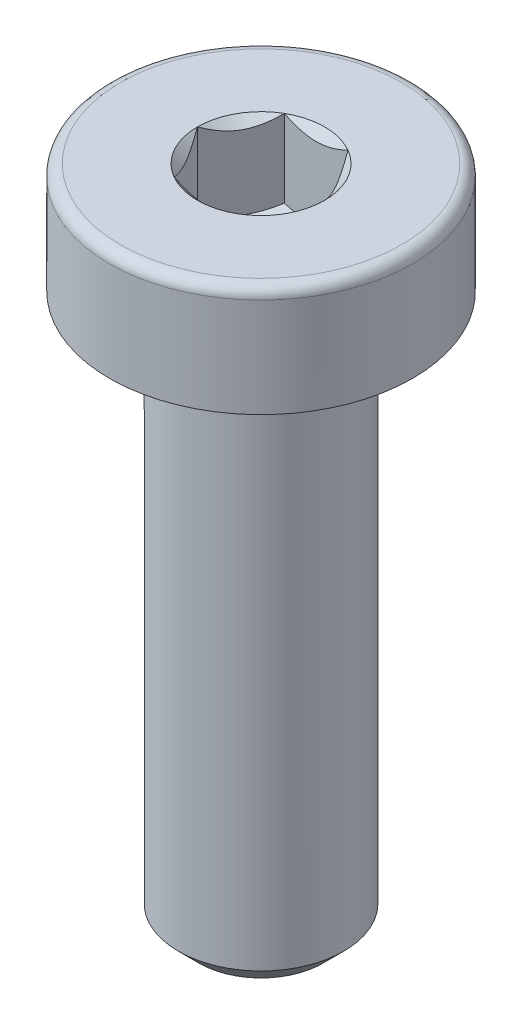
ISO-10303-21;
HEADER;
FILE_DESCRIPTION(('STEP AP214'),'2;1');
FILE_NAME('part.step','',(''),(''),'','','');
FILE_SCHEMA(('AUTOMOTIVE_DESIGN { 1 0 10303 214 1 1 1 1 }'));
ENDSEC;
DATA;
#1=APPLICATION_CONTEXT('core data for automotive mechanical design processes');
#2=APPLICATION_PROTOCOL_DEFINITION('international standard','automotive_design',2000,#1);
#3=PRODUCT_CONTEXT('',#1,'mechanical');
#4=PRODUCT('Part','Part','',(#3));
#5=PRODUCT_RELATED_PRODUCT_CATEGORY('part','',(#4));
#6=PRODUCT_DEFINITION_FORMATION('','',#4);
#7=PRODUCT_DEFINITION_CONTEXT('part definition',#1,'design');
#8=PRODUCT_DEFINITION('design','',#6,#7);
#9=PRODUCT_DEFINITION_SHAPE('','',#8);
#10=(LENGTH_UNIT() NAMED_UNIT(*) SI_UNIT(.MILLI.,.METRE.));
#11=(NAMED_UNIT(*) PLANE_ANGLE_UNIT() SI_UNIT($,.RADIAN.));
#12=(NAMED_UNIT(*) SI_UNIT($,.STERADIAN.) SOLID_ANGLE_UNIT());
#13=UNCERTAINTY_MEASURE_WITH_UNIT(LENGTH_MEASURE(1.E-05),#10,'distance_accuracy_value','');
#14=(GEOMETRIC_REPRESENTATION_CONTEXT(3) GLOBAL_UNCERTAINTY_ASSIGNED_CONTEXT((#13)) GLOBAL_UNIT_ASSIGNED_CONTEXT((#10,
#11,#12)) REPRESENTATION_CONTEXT('',''));
#15=CARTESIAN_POINT('',(0.,0.,0.));
#16=DIRECTION('',(0.,0.,1.));
#17=DIRECTION('',(1.,0.,0.));
#18=AXIS2_PLACEMENT_3D('',#15,#16,#17);
#19=CARTESIAN_POINT('',(0.,-0.2,0.));
#20=DIRECTION('',(0.,1.,0.));
#21=DIRECTION('',(0.,0.,1.));
#22=AXIS2_PLACEMENT_3D('',#19,#20,#21);
#23=TOROIDAL_SURFACE('',#22,1.7,0.2);
#24=CARTESIAN_POINT('',(0.,0.,0.));
#25=DIRECTION('',(0.,1.,0.));
#26=DIRECTION('',(0.,0.,1.));
#27=AXIS2_PLACEMENT_3D('',#24,#25,#26);
#28=CIRCLE('',#27,1.7);
#29=CARTESIAN_POINT('',(0.,0.,1.7));
#30=VERTEX_POINT('',#29);
#31=EDGE_CURVE('E143',#30,#30,#28,.T.);
#32=ORIENTED_EDGE('',*,*,#31,.F.);
#33=EDGE_LOOP('',(#32));
#34=FACE_BOUND('',#33,.T.);
#35=CARTESIAN_POINT('',(0.,-0.2,0.));
#36=DIRECTION('',(0.,-1.,0.));
#37=DIRECTION('',(0.,0.,1.));
#38=AXIS2_PLACEMENT_3D('',#35,#36,#37);
#39=CIRCLE('',#38,1.5);
#40=CARTESIAN_POINT('',(0.,-0.2,1.5));
#41=VERTEX_POINT('',#40);
#42=EDGE_CURVE('E422',#41,#41,#39,.T.);
#43=ORIENTED_EDGE('',*,*,#42,.F.);
#44=EDGE_LOOP('',(#43));
#45=FACE_BOUND('',#44,.T.);
#46=ADVANCED_FACE('F15',(#34,#45),#23,.F.);
#47=CARTESIAN_POINT('',(0.,-10.,0.));
#48=DIRECTION('',(0.,1.,0.));
#49=DIRECTION('',(1.,0.,0.));
#50=AXIS2_PLACEMENT_3D('',#47,#48,#49);
#51=PLANE('',#50);
#52=CARTESIAN_POINT('',(0.,-10.,0.));
#53=DIRECTION('',(0.,-1.,0.));
#54=DIRECTION('',(0.,0.,1.));
#55=AXIS2_PLACEMENT_3D('',#52,#53,#54);
#56=CIRCLE('',#55,1.125);
#57=CARTESIAN_POINT('',(0.,-10.,1.125));
#58=VERTEX_POINT('',#57);
#59=EDGE_CURVE('E10',#58,#58,#56,.T.);
#60=ORIENTED_EDGE('',*,*,#59,.T.);
#61=EDGE_LOOP('',(#60));
#62=FACE_BOUND('',#61,.T.);
#63=ADVANCED_FACE('F510',(#62),#51,.F.);
#64=CARTESIAN_POINT('',(0.,-10.125,0.));
#65=DIRECTION('',(0.,1.,0.));
#66=DIRECTION('',(-1.,0.,0.));
#67=AXIS2_PLACEMENT_3D('',#64,#65,#66);
#68=CONICAL_SURFACE('',#67,1.,0.785398163397448);
#69=ORIENTED_EDGE('',*,*,#59,.F.);
#70=EDGE_LOOP('',(#69));
#71=FACE_BOUND('',#70,.T.);
#72=CARTESIAN_POINT('',(0.,-9.625,0.));
#73=DIRECTION('',(0.,-1.,0.));
#74=DIRECTION('',(-1.,0.,0.));
#75=AXIS2_PLACEMENT_3D('',#72,#73,#74);
#76=CIRCLE('',#75,1.5);
#77=CARTESIAN_POINT('',(-1.5,-9.625,0.));
#78=VERTEX_POINT('',#77);
#79=EDGE_CURVE('E418',#78,#78,#76,.T.);
#80=ORIENTED_EDGE('',*,*,#79,.T.);
#81=EDGE_LOOP('',(#80));
#82=FACE_BOUND('',#81,.T.);
#83=ADVANCED_FACE('F308',(#71,#82),#68,.T.);
#84=CARTESIAN_POINT('',(-1.15470053837925,0.5,0.));
#85=DIRECTION('',(-0.866025403784439,0.,0.5));
#86=DIRECTION('',(0.,1.,0.));
#87=AXIS2_PLACEMENT_3D('',#84,#85,#86);
#88=PLANE('',#87);
#89=CARTESIAN_POINT('',(-1.15470053837925,2.,0.));
#90=CARTESIAN_POINT('',(-1.00117078125086,1.84647024287162,0.265921339820074));
#91=CARTESIAN_POINT('',(-0.867089249093141,1.84530172515184,0.498157365873931));
#92=CARTESIAN_POINT('',(-0.733215253083504,1.8441350161052,0.730033928774895));
#93=CARTESIAN_POINT('',(-0.57735026918948,1.99999999999927,1.00000000000025));
#94=B_SPLINE_CURVE_WITH_KNOTS('',2,(#89,#90,#91,#92,#93),.UNSPECIFIED.,.F.,.F.,(3,2,3),(0.,0.5,
1.),.UNSPECIFIED.);
#95=CARTESIAN_POINT('',(-1.15470053837925,2.,0.));
#96=VERTEX_POINT('',#95);
#97=CARTESIAN_POINT('',(-0.577350269189626,2.,1.));
#98=VERTEX_POINT('',#97);
#99=EDGE_CURVE('E135',#96,#98,#94,.T.);
#100=ORIENTED_EDGE('',*,*,#99,.T.);
#101=DIRECTION('',(0.,1.,0.));
#102=VECTOR('',#101,1.);
#103=CARTESIAN_POINT('',(-0.577350269189626,0.5,1.));
#104=LINE('',#103,#102);
#105=CARTESIAN_POINT('',(-0.577350269189626,0.589316397477042,1.));
#106=VERTEX_POINT('',#105);
#107=EDGE_CURVE('E118',#106,#98,#104,.T.);
#108=ORIENTED_EDGE('',*,*,#107,.F.);
#109=CARTESIAN_POINT('',(-1.15470053837925,0.589316397477043,0.));
#110=CARTESIAN_POINT('',(-1.1422776254852,0.582145061548454,0.021515887063845));
#111=CARTESIAN_POINT('',(-1.12980572440145,0.575290529962869,0.0431130815008311));
#112=CARTESIAN_POINT('',(-1.10516877386456,0.562518070323557,0.0858404042081745));
#113=CARTESIAN_POINT('',(-1.09300571707735,0.556578244850613,0.106965156736799));
#114=CARTESIAN_POINT('',(-1.06894241920652,0.545632531934319,0.148883907199831));
#115=CARTESIAN_POINT('',(-1.05704304561731,0.540607317583832,0.169673316642415));
#116=CARTESIAN_POINT('',(-1.03344126715609,0.531488117613305,0.211063578718422));
#117=CARTESIAN_POINT('',(-1.02173909837023,0.527379242171332,0.231661269176965));
#118=CARTESIAN_POINT('',(-0.998439619296902,0.520087570224119,0.272815704232481));
#119=CARTESIAN_POINT('',(-0.986842367431211,0.516896357949622,0.293370983478975));
#120=CARTESIAN_POINT('',(-0.963630649649038,0.511432897740972,0.33458880079611));
#121=CARTESIAN_POINT('',(-0.952016187375457,0.509160477291832,0.355251317992815));
#122=CARTESIAN_POINT('',(-0.928615137972573,0.505525933544308,0.396828053797181));
#123=CARTESIAN_POINT('',(-0.916827980653532,0.504172969622274,0.41774275139525));
#124=CARTESIAN_POINT('',(-0.892891053471395,0.502367479696766,0.459958305071784));
#125=CARTESIAN_POINT('',(-0.88073874884194,0.501933526563364,0.481258507610898));
#126=CARTESIAN_POINT('',(-0.856257235695783,0.501957698326459,0.523654214585648));
#127=CARTESIAN_POINT('',(-0.843928822248721,0.502412614939665,0.544750180023796));
#128=CARTESIAN_POINT('',(-0.819420681665752,0.504253995001974,0.586439287846091));
#129=CARTESIAN_POINT('',(-0.80724270276635,0.505622235893781,0.607034252182705));
#130=CARTESIAN_POINT('',(-0.783017066755103,0.509280885955065,0.647952632793485));
#131=CARTESIAN_POINT('',(-0.770969274303699,0.511562376898162,0.668276765739735));
#132=CARTESIAN_POINT('',(-0.746956492541301,0.51703779791969,0.708859066345339));
#133=CARTESIAN_POINT('',(-0.734991529583474,0.520232005852064,0.729117212014218));
#134=CARTESIAN_POINT('',(-0.711075209617807,0.527523596594688,0.769746807127452));
#135=CARTESIAN_POINT('',(-0.699125090769733,0.531629372272877,0.790117471798635));
#136=CARTESIAN_POINT('',(-0.675154824355723,0.540736433878131,0.831125976310756));
#137=CARTESIAN_POINT('',(-0.663137276162293,0.545752483880906,0.851762040669467));
#138=CARTESIAN_POINT('',(-0.638941132936142,0.556674024791821,0.893430606128303));
#139=CARTESIAN_POINT('',(-0.626766044340648,0.562598648059455,0.914460089337463));
#140=CARTESIAN_POINT('',(-0.602159683115032,0.575334898103387,0.957023431622116));
#141=CARTESIAN_POINT('',(-0.58973203881774,0.582168191432241,0.978552925679333));
#142=CARTESIAN_POINT('',(-0.57735026918962,0.589316397477036,0.999999999999998));
#143=B_SPLINE_CURVE_WITH_KNOTS('',3,(#109,#110,#111,#112,#113,#114,#115,#116,#117,#118,#119,
#120,#121,#122,#123,#124,#125,#126,#127,#128,#129,#130,#131,#132,#133,#134,#135,#136,#137,#138,
#139,#140,#141,#142),.UNSPECIFIED.,.F.,.F.,(4,2,2,2,2,2,2,2,2,2,2,2,2,2,2,2,4),(0.,
0.0775799336285172,0.15283713344211,0.226249266739255,0.298363815314992,0.369794224205565,
0.441211214882481,0.51332960442225,0.586892093802747,0.66018955743096,0.732066645944519,
0.803258313913417,0.8744716775434,0.946370107950428,1.01956032219192,1.09458388807375,
1.17191346643988),.UNSPECIFIED.);
#144=CARTESIAN_POINT('',(-1.15470053837925,0.589316397477044,0.));
#145=VERTEX_POINT('',#144);
#146=EDGE_CURVE('E245',#145,#106,#143,.T.);
#147=ORIENTED_EDGE('',*,*,#146,.F.);
#148=DIRECTION('',(0.,1.,0.));
#149=VECTOR('',#148,1.);
#150=CARTESIAN_POINT('',(-1.15470053837925,0.5,0.));
#151=LINE('',#150,#149);
#152=EDGE_CURVE('E29',#145,#96,#151,.T.);
#153=ORIENTED_EDGE('',*,*,#152,.T.);
#154=EDGE_LOOP('',(#100,#108,#147,#153));
#155=FACE_BOUND('',#154,.T.);
#156=ADVANCED_FACE('F138',(#155),#88,.F.);
#157=CARTESIAN_POINT('',(-0.577350269189624,0.5,-1.));
#158=DIRECTION('',(-0.866025403784438,0.,-0.5));
#159=DIRECTION('',(-0.5,0.,0.866025403784438));
#160=AXIS2_PLACEMENT_3D('',#157,#158,#159);
#161=PLANE('',#160);
#162=CARTESIAN_POINT('',(-0.577350269189625,2.,-0.999999999999998));
#163=CARTESIAN_POINT('',(-0.730880026318,1.84647024287162,-0.734078660179944));
#164=CARTESIAN_POINT('',(-0.864961558475733,1.84530172515184,-0.501842634126069));
#165=CARTESIAN_POINT('',(-0.998835554485382,1.8441350161052,-0.269966071225084));
#166=CARTESIAN_POINT('',(-1.15470053837939,1.99999999999928,2.43945488809238E-13));
#167=B_SPLINE_CURVE_WITH_KNOTS('',2,(#162,#163,#164,#165,#166),.UNSPECIFIED.,.F.,.F.,(3,2,3),
(0.,0.5,1.),.UNSPECIFIED.);
#168=CARTESIAN_POINT('',(-0.577350269189625,2.,-1.));
#169=VERTEX_POINT('',#168);
#170=EDGE_CURVE('E339',#169,#96,#167,.T.);
#171=ORIENTED_EDGE('',*,*,#170,.T.);
#172=ORIENTED_EDGE('',*,*,#152,.F.);
#173=CARTESIAN_POINT('',(-0.577350269189627,0.589316397477045,-1.));
#174=CARTESIAN_POINT('',(-0.589772117524805,0.582145061548479,-0.978483498312897));
#175=CARTESIAN_POINT('',(-0.602239886015797,0.575290529962917,-0.956883917922458));
#176=CARTESIAN_POINT('',(-0.626924357647565,0.562518070323645,-0.914184031532187));
#177=CARTESIAN_POINT('',(-0.639137401592391,0.556578244850719,-0.893088139102523));
#178=CARTESIAN_POINT('',(-0.663408455452852,0.54563253193445,-0.851289336616123));
#179=CARTESIAN_POINT('',(-0.675462925365203,0.540607317583974,-0.830589472077488));
#180=CARTESIAN_POINT('',(-0.699507054561722,0.53148811761346,-0.789454601317619));
#181=CARTESIAN_POINT('',(-0.711494093365185,0.527379242171491,-0.769021380640425));
#182=CARTESIAN_POINT('',(-0.735485140065021,0.520087570224278,-0.728266222340228));
#183=CARTESIAN_POINT('',(-0.747487908141538,0.516896357949778,-0.707945067987197));
#184=CARTESIAN_POINT('',(-0.771577726135665,0.511432897741115,-0.667234222063753));
#185=CARTESIAN_POINT('',(-0.783664759797369,0.509160477291966,-0.646844544085154));
#186=CARTESIAN_POINT('',(-0.807970744508966,0.505525933544416,-0.605790272924778));
#187=CARTESIAN_POINT('',(-0.820189825281854,0.504172969622366,-0.585124946448999));
#188=CARTESIAN_POINT('',(-0.844781103609498,0.502367479696817,-0.54328718258234));
#189=CARTESIAN_POINT('',(-0.857151467799394,0.501933526563389,-0.522112876789074));
#190=CARTESIAN_POINT('',(-0.881626470477781,0.501957698326439,-0.479713410994005));
#191=CARTESIAN_POINT('',(-0.89373190574098,0.50241261493962,-0.458488709041452));
#192=CARTESIAN_POINT('',(-0.917581661884609,0.504253995001887,-0.416419482786004));
#193=CARTESIAN_POINT('',(-0.929328434740412,0.505622235893679,-0.395575561524098));
#194=CARTESIAN_POINT('',(-0.952651973825387,0.509280885954937,-0.354136355010195));
#195=CARTESIAN_POINT('',(-0.964229293041011,0.511562376898024,-0.333540594214658));
#196=CARTESIAN_POINT('',(-0.987368205428263,0.517037797919539,-0.292453764890132));
#197=CARTESIAN_POINT('',(-0.998929792732163,0.52023200585191,-0.271962730178892));
#198=CARTESIAN_POINT('',(-1.02215789426288,0.527523596594534,-0.230935791966992));
#199=CARTESIAN_POINT('',(-1.03382434793608,0.531629372272727,-0.210401353130728));
#200=CARTESIAN_POINT('',(-1.05735362140782,0.540736433877994,-0.169138241224641));
#201=CARTESIAN_POINT('',(-1.06921620327991,0.54575248388078,-0.148412707018555));
#202=CARTESIAN_POINT('',(-1.09320416789351,0.55667402479172,-0.106623949581629));
#203=CARTESIAN_POINT('',(-1.10532869028339,0.562598648059372,-0.0855652719599876));
#204=CARTESIAN_POINT('',(-1.12988644535915,0.575334898103344,-0.0429738669014798));
#205=CARTESIAN_POINT('',(-1.14231771199472,0.58216819143222,-0.0214464642021553));
#206=CARTESIAN_POINT('',(-1.15470053837925,0.589316397477038,0.));
#207=B_SPLINE_CURVE_WITH_KNOTS('',3,(#173,#174,#175,#176,#177,#178,#179,#180,#181,#182,#183,
#184,#185,#186,#187,#188,#189,#190,#191,#192,#193,#194,#195,#196,#197,#198,#199,#200,#201,#202,
#203,#204,#205,#206),.UNSPECIFIED.,.F.,.F.,(4,2,2,2,2,2,2,2,2,2,2,2,2,2,2,2,4),(0.,
0.0775799336282744,0.152837133441706,0.226249266738765,0.298363815314486,0.369794224205106,
0.441211214882123,0.513329604422042,0.586892093802727,0.660189557430751,0.73206664594416,
0.803258313912957,0.874471677542892,0.946370107949937,1.01956032219152,1.09458388807351,
1.17191346643989),.UNSPECIFIED.);
#208=CARTESIAN_POINT('',(-0.577350269189625,0.589316397477047,-1.));
#209=VERTEX_POINT('',#208);
#210=EDGE_CURVE('E421',#209,#145,#207,.T.);
#211=ORIENTED_EDGE('',*,*,#210,.F.);
#212=DIRECTION('',(0.,1.,0.));
#213=VECTOR('',#212,1.);
#214=CARTESIAN_POINT('',(-0.577350269189625,0.5,-1.));
#215=LINE('',#214,#213);
#216=EDGE_CURVE('E330',#209,#169,#215,.T.);
#217=ORIENTED_EDGE('',*,*,#216,.T.);
#218=EDGE_LOOP('',(#171,#172,#211,#217));
#219=FACE_BOUND('',#218,.T.);
#220=ADVANCED_FACE('F208',(#219),#161,.F.);
#221=CARTESIAN_POINT('',(0.577350269189628,0.5,-1.));
#222=DIRECTION('',(0.,0.,-1.));
#223=DIRECTION('',(0.,-1.,0.));
#224=AXIS2_PLACEMENT_3D('',#221,#222,#223);
#225=PLANE('',#224);
#226=CARTESIAN_POINT('',(0.577350269189625,2.,-1.));
#227=CARTESIAN_POINT('',(0.270060534721078,1.84635513276574,-1.));
#228=CARTESIAN_POINT('',(0.000495609398556127,1.84529958443508,-1.));
#229=CARTESIAN_POINT('',(-0.265863448139593,1.84425658947496,-1.));
#230=CARTESIAN_POINT('',(-0.577350269189632,2.,-1.));
#231=B_SPLINE_CURVE_WITH_KNOTS('',2,(#226,#227,#228,#229,#230),.UNSPECIFIED.,.F.,.F.,(3,2,3),
(0.,0.5,1.),.UNSPECIFIED.);
#232=CARTESIAN_POINT('',(0.577350269189628,2.,-1.));
#233=VERTEX_POINT('',#232);
#234=EDGE_CURVE('E377',#233,#169,#231,.T.);
#235=ORIENTED_EDGE('',*,*,#234,.T.);
#236=ORIENTED_EDGE('',*,*,#216,.F.);
#237=CARTESIAN_POINT('',(0.577350269189629,0.589316397477046,-1.));
#238=CARTESIAN_POINT('',(0.552505507960357,0.582145061548458,-0.999999385376672));
#239=CARTESIAN_POINT('',(0.527565838385578,0.575290529962872,-0.999996999423149));
#240=CARTESIAN_POINT('',(0.47824441621688,0.56251807032356,-1.0000244357401));
#241=CARTESIAN_POINT('',(0.453868315484823,0.556578244850616,-1.00005329583901));
#242=CARTESIAN_POINT('',(0.405533963753522,0.545632531934322,-1.00017324381556));
#243=CARTESIAN_POINT('',(0.381580120251964,0.540607317583835,-1.00026278871947));
#244=CARTESIAN_POINT('',(0.333934212594235,0.531488117613308,-1.00051818003557));
#245=CARTESIAN_POINT('',(0.310245005004916,0.527379242171335,-1.00068264981691));
#246=CARTESIAN_POINT('',(0.262954479231781,0.520087570224122,-1.00108192657222));
#247=CARTESIAN_POINT('',(0.239354459289589,0.516896357949625,-1.00131605146569));
#248=CARTESIAN_POINT('',(0.192052923513318,0.511432897740975,-1.00182302285942));
#249=CARTESIAN_POINT('',(0.168351427578049,0.509160477291835,-1.00209586207756));
#250=CARTESIAN_POINT('',(0.120644393463594,0.505525933544311,-1.00261832672163));
#251=CARTESIAN_POINT('',(0.0966381553716762,0.504172969622278,-1.00286769784397));
#252=CARTESIAN_POINT('',(0.0481099498619062,0.50236747969677,-1.00324548765397));
#253=CARTESIAN_POINT('',(0.023587281042553,0.501933526563368,-1.00337138439989));
#254=CARTESIAN_POINT('',(-0.0253692347820597,0.501957698326463,-1.00336762557961));
#255=CARTESIAN_POINT('',(-0.0498030834923871,0.502412614939669,-1.00323888906517));
#256=CARTESIAN_POINT('',(-0.0981609802190884,0.504253995001978,-1.00285877063195));
#257=CARTESIAN_POINT('',(-0.122085731974333,0.505622235893786,-1.00260981370662));
#258=CARTESIAN_POINT('',(-0.169634907070614,0.509280885955069,-1.00208898780344));
#259=CARTESIAN_POINT('',(-0.193260018737662,0.511562376898166,-1.00181735995412));
#260=CARTESIAN_POINT('',(-0.240411712887332,0.517037797919695,-1.00131283123516));
#261=CARTESIAN_POINT('',(-0.26393826314906,0.520232005852068,-1.00107994219278));
#262=CARTESIAN_POINT('',(-0.31108268464543,0.527523596594693,-1.00068259909409));
#263=CARTESIAN_POINT('',(-0.334699257166686,0.531629372272882,-1.00051882492901));
#264=CARTESIAN_POINT('',(-0.382198797052396,0.540736433878136,-1.00026421753506));
#265=CARTESIAN_POINT('',(-0.406078927117886,0.545752483880911,-1.0001747476877));
#266=CARTESIAN_POINT('',(-0.454263034957568,0.556674024791826,-1.00005455570966));
#267=CARTESIAN_POINT('',(-0.478562645942905,0.56259864805946,-1.00002536129722));
#268=CARTESIAN_POINT('',(-0.527726762244194,0.575334898103392,-0.999997298523466));
#269=CARTESIAN_POINT('',(-0.552585673177015,0.582168191432246,-0.999999389881423));
#270=CARTESIAN_POINT('',(-0.577350269189624,0.589316397477041,-0.999999999999998));
#271=B_SPLINE_CURVE_WITH_KNOTS('',3,(#237,#238,#239,#240,#241,#242,#243,#244,#245,#246,#247,
#248,#249,#250,#251,#252,#253,#254,#255,#256,#257,#258,#259,#260,#261,#262,#263,#264,#265,#266,
#267,#268,#269,#270),.UNSPECIFIED.,.F.,.F.,(4,2,2,2,2,2,2,2,2,2,2,2,2,2,2,2,4),(0.,
0.0775799336285192,0.152837133442114,0.22624926673926,0.298363815314997,0.369794224205569,
0.441211214882483,0.513329604422249,0.586892093802744,0.660189557430959,0.732066645944521,
0.803258313913422,0.874471677543404,0.946370107950433,1.01956032219193,1.09458388807376,
1.17191346643988),.UNSPECIFIED.);
#272=CARTESIAN_POINT('',(0.577350269189628,0.589316397477047,-1.));
#273=VERTEX_POINT('',#272);
#274=EDGE_CURVE('E171',#273,#209,#271,.T.);
#275=ORIENTED_EDGE('',*,*,#274,.F.);
#276=DIRECTION('',(0.,1.,0.));
#277=VECTOR('',#276,1.);
#278=CARTESIAN_POINT('',(0.577350269189628,0.5,-1.));
#279=LINE('',#278,#277);
#280=EDGE_CURVE('E110',#273,#233,#279,.T.);
#281=ORIENTED_EDGE('',*,*,#280,.T.);
#282=EDGE_LOOP('',(#235,#236,#275,#281));
#283=FACE_BOUND('',#282,.T.);
#284=ADVANCED_FACE('F388',(#283),#225,.F.);
#285=CARTESIAN_POINT('',(1.15470053837925,0.5,0.));
#286=DIRECTION('',(0.866025403784439,0.,-0.5));
#287=DIRECTION('',(0.,-1.,0.));
#288=AXIS2_PLACEMENT_3D('',#285,#286,#287);
#289=PLANE('',#288);
#290=CARTESIAN_POINT('',(1.15470053837925,2.,0.));
#291=CARTESIAN_POINT('',(1.00117078125086,1.84647024287162,-0.265921339820078));
#292=CARTESIAN_POINT('',(0.867089249093142,1.84530172515184,-0.498157365873931));
#293=CARTESIAN_POINT('',(0.733215253083495,1.84413501610522,-0.730033928774914));
#294=CARTESIAN_POINT('',(0.577350269189482,1.99999999999929,-1.00000000000025));
#295=B_SPLINE_CURVE_WITH_KNOTS('',2,(#290,#291,#292,#293,#294),.UNSPECIFIED.,.F.,.F.,(3,2,3),
(0.,0.5,1.),.UNSPECIFIED.);
#296=CARTESIAN_POINT('',(1.15470053837925,2.,0.));
#297=VERTEX_POINT('',#296);
#298=EDGE_CURVE('E433',#297,#233,#295,.T.);
#299=ORIENTED_EDGE('',*,*,#298,.T.);
#300=ORIENTED_EDGE('',*,*,#280,.F.);
#301=CARTESIAN_POINT('',(1.15470053837925,0.589316397477043,0.));
#302=CARTESIAN_POINT('',(1.1422776254852,0.582145061548455,-0.0215158870638419));
#303=CARTESIAN_POINT('',(1.12980572440145,0.575290529962869,-0.0431130815008281));
#304=CARTESIAN_POINT('',(1.10516877386457,0.562518070323558,-0.0858404042081722));
#305=CARTESIAN_POINT('',(1.09300571707735,0.556578244850615,-0.106965156736797));
#306=CARTESIAN_POINT('',(1.06894241920652,0.545632531934321,-0.148883907199829));
#307=CARTESIAN_POINT('',(1.05704304561732,0.540607317583834,-0.169673316642413));
#308=CARTESIAN_POINT('',(1.03344126715609,0.531488117613307,-0.211063578718421));
#309=CARTESIAN_POINT('',(1.02173909837023,0.527379242171335,-0.231661269176964));
#310=CARTESIAN_POINT('',(0.998439619296906,0.520087570224122,-0.272815704232479));
#311=CARTESIAN_POINT('',(0.986842367431215,0.516896357949625,-0.293370983478973));
#312=CARTESIAN_POINT('',(0.963630649649042,0.511432897740975,-0.334588800796107));
#313=CARTESIAN_POINT('',(0.952016187375462,0.509160477291835,-0.355251317992812));
#314=CARTESIAN_POINT('',(0.928615137972578,0.505525933544311,-0.396828053797177));
#315=CARTESIAN_POINT('',(0.916827980653537,0.504172969622278,-0.417742751395246));
#316=CARTESIAN_POINT('',(0.892891053471401,0.50236747969677,-0.459958305071779));
#317=CARTESIAN_POINT('',(0.880738748841946,0.501933526563367,-0.481258507610893));
#318=CARTESIAN_POINT('',(0.856257235695789,0.501957698326462,-0.523654214585642));
#319=CARTESIAN_POINT('',(0.843928822248727,0.502412614939669,-0.54475018002379));
#320=CARTESIAN_POINT('',(0.819420681665758,0.504253995001977,-0.586439287846085));
#321=CARTESIAN_POINT('',(0.807242702766356,0.505622235893785,-0.6070342521827));
#322=CARTESIAN_POINT('',(0.783017066755108,0.509280885955068,-0.64795263279348));
#323=CARTESIAN_POINT('',(0.770969274303704,0.511562376898166,-0.66827676573973));
#324=CARTESIAN_POINT('',(0.746956492541306,0.517037797919694,-0.708859066345335));
#325=CARTESIAN_POINT('',(0.734991529583479,0.520232005852067,-0.729117212014214));
#326=CARTESIAN_POINT('',(0.711075209617813,0.527523596594692,-0.769746807127448));
#327=CARTESIAN_POINT('',(0.699125090769738,0.531629372272881,-0.790117471798631));
#328=CARTESIAN_POINT('',(0.675154824355728,0.540736433878135,-0.831125976310752));
#329=CARTESIAN_POINT('',(0.663137276162299,0.545752483880911,-0.851762040669464));
#330=CARTESIAN_POINT('',(0.638941132936147,0.556674024791825,-0.8934306061283));
#331=CARTESIAN_POINT('',(0.626766044340653,0.562598648059459,-0.91446008933746));
#332=CARTESIAN_POINT('',(0.602159683115038,0.575334898103392,-0.957023431622114));
#333=CARTESIAN_POINT('',(0.589732038817745,0.582168191432245,-0.978552925679331));
#334=CARTESIAN_POINT('',(0.577350269189625,0.589316397477041,-0.999999999999997));
#335=B_SPLINE_CURVE_WITH_KNOTS('',3,(#301,#302,#303,#304,#305,#306,#307,#308,#309,#310,#311,
#312,#313,#314,#315,#316,#317,#318,#319,#320,#321,#322,#323,#324,#325,#326,#327,#328,#329,#330,
#331,#332,#333,#334),.UNSPECIFIED.,.F.,.F.,(4,2,2,2,2,2,2,2,2,2,2,2,2,2,2,2,4),(0.,
0.0775799336285166,0.15283713344211,0.226249266739254,0.298363815314991,0.369794224205563,
0.441211214882478,0.513329604422245,0.586892093802741,0.660189557430954,0.732066645944514,
0.803258313913414,0.874471677543396,0.946370107950424,1.01956032219192,1.09458388807375,
1.17191346643988),.UNSPECIFIED.);
#336=CARTESIAN_POINT('',(1.15470053837925,0.589316397477045,0.));
#337=VERTEX_POINT('',#336);
#338=EDGE_CURVE('E240',#337,#273,#335,.T.);
#339=ORIENTED_EDGE('',*,*,#338,.F.);
#340=DIRECTION('',(0.,1.,0.));
#341=VECTOR('',#340,1.);
#342=CARTESIAN_POINT('',(1.15470053837925,0.5,0.));
#343=LINE('',#342,#341);
#344=EDGE_CURVE('E131',#337,#297,#343,.T.);
#345=ORIENTED_EDGE('',*,*,#344,.T.);
#346=EDGE_LOOP('',(#299,#300,#339,#345));
#347=FACE_BOUND('',#346,.T.);
#348=ADVANCED_FACE('F268',(#347),#289,.F.);
#349=CARTESIAN_POINT('',(0.577350269189626,0.5,1.));
#350=DIRECTION('',(0.866025403784439,0.,0.5));
#351=DIRECTION('',(0.,-1.,0.));
#352=AXIS2_PLACEMENT_3D('',#349,#350,#351);
#353=PLANE('',#352);
#354=CARTESIAN_POINT('',(0.577350269189625,2.,1.));
#355=CARTESIAN_POINT('',(0.730880026318006,1.84647024287162,0.734078660179936));
#356=CARTESIAN_POINT('',(0.864961558475735,1.84530172515183,0.501842634126069));
#357=CARTESIAN_POINT('',(0.998835554485375,1.8441350161052,0.269966071225099));
#358=CARTESIAN_POINT('',(1.1547005383794,1.99999999999928,-2.51968584885631E-13));
#359=B_SPLINE_CURVE_WITH_KNOTS('',2,(#354,#355,#356,#357,#358),.UNSPECIFIED.,.F.,.F.,(3,2,3),
(0.,0.5,1.),.UNSPECIFIED.);
#360=CARTESIAN_POINT('',(0.577350269189626,2.,1.));
#361=VERTEX_POINT('',#360);
#362=EDGE_CURVE('E166',#361,#297,#359,.T.);
#363=ORIENTED_EDGE('',*,*,#362,.T.);
#364=ORIENTED_EDGE('',*,*,#344,.F.);
#365=CARTESIAN_POINT('',(0.577350269189629,0.589316397477041,1.));
#366=CARTESIAN_POINT('',(0.589772117524845,0.582145061548453,0.97848349831283));
#367=CARTESIAN_POINT('',(0.602239886015871,0.575290529962867,0.95688391792232));
#368=CARTESIAN_POINT('',(0.626924357647685,0.562518070323555,0.914184031531926));
#369=CARTESIAN_POINT('',(0.639137401592525,0.556578244850612,0.893088139102211));
#370=CARTESIAN_POINT('',(0.663408455452999,0.545632531934318,0.851289336615727));
#371=CARTESIAN_POINT('',(0.675462925365349,0.540607317583831,0.83058947207706));
#372=CARTESIAN_POINT('',(0.699507054561857,0.531488117613304,0.789454601317146));
#373=CARTESIAN_POINT('',(0.71149409336531,0.527379242171332,0.769021380639941));
#374=CARTESIAN_POINT('',(0.735485140065122,0.520087570224119,0.728266222339741));
#375=CARTESIAN_POINT('',(0.747487908141624,0.516896357949621,0.70794506798672));
#376=CARTESIAN_POINT('',(0.771577726135722,0.511432897740971,0.667234222063315));
#377=CARTESIAN_POINT('',(0.783664759797411,0.509160477291832,0.646844544084746));
#378=CARTESIAN_POINT('',(0.807970744508983,0.505525933544308,0.605790272924451));
#379=CARTESIAN_POINT('',(0.82018982528186,0.504172969622274,0.585124946448723));
#380=CARTESIAN_POINT('',(0.844781103609495,0.502367479696766,0.543287182582189));
#381=CARTESIAN_POINT('',(0.857151467799393,0.501933526563364,0.522112876788997));
#382=CARTESIAN_POINT('',(0.881626470477849,0.501957698326459,0.479713410993967));
#383=CARTESIAN_POINT('',(0.893731905741113,0.502412614939665,0.458488709041379));
#384=CARTESIAN_POINT('',(0.917581661884845,0.504253995001974,0.41641948278586));
#385=CARTESIAN_POINT('',(0.929328434740686,0.505622235893782,0.395575561523919));
#386=CARTESIAN_POINT('',(0.952651973825719,0.509280885955065,0.354136355009953));
#387=CARTESIAN_POINT('',(0.964229293041362,0.511562376898163,0.333540594214389));
#388=CARTESIAN_POINT('',(0.987368205428633,0.517037797919691,0.292453764889818));
#389=CARTESIAN_POINT('',(0.998929792732534,0.520232005852065,0.27196273017856));
#390=CARTESIAN_POINT('',(1.02215789426324,0.527523596594689,0.230935791966639));
#391=CARTESIAN_POINT('',(1.03382434793642,0.531629372272878,0.210401353130372));
#392=CARTESIAN_POINT('',(1.05735362140812,0.540736433878132,0.169138241224298));
#393=CARTESIAN_POINT('',(1.06921620328018,0.545752483880908,0.148412707018228));
#394=CARTESIAN_POINT('',(1.09320416789371,0.556674024791822,0.106623949581356));
#395=CARTESIAN_POINT('',(1.10532869028355,0.562598648059457,0.0855652719597518));
#396=CARTESIAN_POINT('',(1.12988644535923,0.575334898103389,0.0429738669013457));
#397=CARTESIAN_POINT('',(1.14231771199476,0.582168191432243,0.0214464642020851));
#398=CARTESIAN_POINT('',(1.15470053837925,0.589316397477038,0.));
#399=B_SPLINE_CURVE_WITH_KNOTS('',3,(#365,#366,#367,#368,#369,#370,#371,#372,#373,#374,#375,
#376,#377,#378,#379,#380,#381,#382,#383,#384,#385,#386,#387,#388,#389,#390,#391,#392,#393,#394,
#395,#396,#397,#398),.UNSPECIFIED.,.F.,.F.,(4,2,2,2,2,2,2,2,2,2,2,2,2,2,2,2,4),(0.,
0.077579933628518,0.152837133442112,0.226249266739257,0.298363815314994,0.369794224205567,
0.441211214882482,0.51332960442225,0.586892093802747,0.66018955743096,0.73206664594452,
0.803258313913421,0.874471677543402,0.946370107950432,1.01956032219193,1.09458388807376,
1.17191346643989),.UNSPECIFIED.);
#400=CARTESIAN_POINT('',(0.577350269189626,0.589316397477042,1.));
#401=VERTEX_POINT('',#400);
#402=EDGE_CURVE('E234',#401,#337,#399,.T.);
#403=ORIENTED_EDGE('',*,*,#402,.F.);
#404=DIRECTION('',(0.,1.,0.));
#405=VECTOR('',#404,1.);
#406=CARTESIAN_POINT('',(0.577350269189626,0.5,1.));
#407=LINE('',#406,#405);
#408=EDGE_CURVE('E132',#401,#361,#407,.T.);
#409=ORIENTED_EDGE('',*,*,#408,.T.);
#410=EDGE_LOOP('',(#363,#364,#403,#409));
#411=FACE_BOUND('',#410,.T.);
#412=ADVANCED_FACE('F231',(#411),#353,.F.);
#413=CARTESIAN_POINT('',(-0.577350269189626,0.5,1.));
#414=DIRECTION('',(0.,0.,1.));
#415=DIRECTION('',(1.,0.,0.));
#416=AXIS2_PLACEMENT_3D('',#413,#414,#415);
#417=PLANE('',#416);
#418=CARTESIAN_POINT('',(-0.577350269189628,2.,1.));
#419=CARTESIAN_POINT('',(-0.270060534721116,1.84635513276573,1.));
#420=CARTESIAN_POINT('',(-0.000495609398554068,1.84529958443507,1.));
#421=CARTESIAN_POINT('',(0.265863448139567,1.84425658947493,1.));
#422=CARTESIAN_POINT('',(0.57735026918964,1.99999999999998,1.));
#423=B_SPLINE_CURVE_WITH_KNOTS('',2,(#418,#419,#420,#421,#422),.UNSPECIFIED.,.F.,.F.,(3,2,3),
(0.,0.5,1.),.UNSPECIFIED.);
#424=EDGE_CURVE('E122',#98,#361,#423,.T.);
#425=ORIENTED_EDGE('',*,*,#424,.T.);
#426=ORIENTED_EDGE('',*,*,#408,.F.);
#427=CARTESIAN_POINT('',(-0.577350269189634,0.589316397477041,1.));
#428=CARTESIAN_POINT('',(-0.552509188921581,0.582146146644213,0.999999410681156));
#429=CARTESIAN_POINT('',(-0.527573353009553,0.575292164970257,0.999996135236956));
#430=CARTESIAN_POINT('',(-0.478262590823696,0.562520705055407,1.00002065921441));
#431=CARTESIAN_POINT('',(-0.45389333238665,0.556581270665785,1.00004752759492));
#432=CARTESIAN_POINT('',(-0.405575701958643,0.5456362325618,1.00016301057745));
#433=CARTESIAN_POINT('',(-0.381631756886763,0.540611223406213,1.00025008725702));
#434=CARTESIAN_POINT('',(-0.334008732251698,0.531492358652863,1.00050074817186));
#435=CARTESIAN_POINT('',(-0.310332529781074,0.527383513863851,1.00066294226553));
#436=CARTESIAN_POINT('',(-0.263071166817641,0.520091829669054,1.00105851823854));
#437=CARTESIAN_POINT('',(-0.239487323334236,0.516900458315821,1.00129119992797));
#438=CARTESIAN_POINT('',(-0.19222135952883,0.511436682987336,1.00179693290733));
#439=CARTESIAN_POINT('',(-0.168539273688525,0.509163980275795,1.0020699710345));
#440=CARTESIAN_POINT('',(-0.120968666616696,0.505535844377386,1.0025937905998));
#441=CARTESIAN_POINT('',(-0.097079738975184,0.504185725886581,1.00284443596971));
#442=CARTESIAN_POINT('',(-0.0487943254453937,0.50237955978456,1.00323031944072));
#443=CARTESIAN_POINT('',(-0.0243971484261165,0.501941729168259,1.00336317618692));
#444=CARTESIAN_POINT('',(0.0245592809649892,0.501949118408598,1.00337596948335));
#445=CARTESIAN_POINT('',(0.0491185329555203,0.502400225959888,1.00325421937165));
#446=CARTESIAN_POINT('',(0.0977190298961206,0.504241049569115,1.00288221391613));
#447=CARTESIAN_POINT('',(0.121760989080045,0.505612186958667,1.00263452525113));
#448=CARTESIAN_POINT('',(0.169446515997906,0.509277290512429,1.00211501192311));
#449=CARTESIAN_POINT('',(0.193091067612033,0.511558499995219,1.00184355979864));
#450=CARTESIAN_POINT('',(0.240278393979013,0.517033608967552,1.0013377544029));
#451=CARTESIAN_POINT('',(0.263821151096014,0.520227660643859,1.00110340732782));
#452=CARTESIAN_POINT('',(0.310994796933776,0.527519245895964,1.00070233954299));
#453=CARTESIAN_POINT('',(0.334624405661577,0.531625056684866,1.00053628092839));
#454=CARTESIAN_POINT('',(0.382146891751851,0.540732463711396,1.00027693006104));
#455=CARTESIAN_POINT('',(0.406036952270331,0.545748725056203,1.00018498786931));
#456=CARTESIAN_POINT('',(0.45423784681058,0.556670954462461,1.00006032566276));
#457=CARTESIAN_POINT('',(0.478544333409609,0.562595976573044,1.00002913833069));
#458=CARTESIAN_POINT('',(0.527719177888323,0.575333243627362,0.999998162712414));
#459=CARTESIAN_POINT('',(0.552581957340031,0.582167096471653,0.999999364873642));
#460=CARTESIAN_POINT('',(0.577350269189627,0.589316397477037,0.999999999999995));
#461=B_SPLINE_CURVE_WITH_KNOTS('',3,(#427,#428,#429,#430,#431,#432,#433,#434,#435,#436,#437,
#438,#439,#440,#441,#442,#443,#444,#445,#446,#447,#448,#449,#450,#451,#452,#453,#454,#455,#456,
#457,#458,#459,#460),.UNSPECIFIED.,.F.,.F.,(4,2,2,2,2,2,2,2,2,2,2,2,2,2,2,2,4),(0.,
0.0775684310572642,0.152805430459757,0.226188371943068,0.298264435464577,0.36964678461188,
0.441005902655604,0.512772707290909,0.585959365421267,0.659632389354974,0.731860756072294,
0.803110382730178,0.874371894883563,0.94630890322294,1.01952840696414,1.09457227613251,
1.17191346564551),.UNSPECIFIED.);
#462=EDGE_CURVE('E125',#106,#401,#461,.T.);
#463=ORIENTED_EDGE('',*,*,#462,.F.);
#464=ORIENTED_EDGE('',*,*,#107,.T.);
#465=EDGE_LOOP('',(#425,#426,#463,#464));
#466=FACE_BOUND('',#465,.T.);
#467=ADVANCED_FACE('F120',(#466),#417,.F.);
#468=CARTESIAN_POINT('',(0.,2.,0.));
#469=DIRECTION('',(0.,1.,0.));
#470=DIRECTION('',(0.,0.,1.));
#471=AXIS2_PLACEMENT_3D('',#468,#469,#470);
#472=CONICAL_SURFACE('',#471,1.15470053837925,0.785398163397448);
#473=ORIENTED_EDGE('',*,*,#99,.F.);
#474=CARTESIAN_POINT('',(0.,2.,0.));
#475=DIRECTION('',(0.,-1.,0.));
#476=DIRECTION('',(-1.,0.,0.));
#477=AXIS2_PLACEMENT_3D('',#474,#475,#476);
#478=CIRCLE('',#477,1.15470053837925);
#479=EDGE_CURVE('E146',#98,#96,#478,.T.);
#480=ORIENTED_EDGE('',*,*,#479,.F.);
#481=EDGE_LOOP('',(#473,#480));
#482=FACE_BOUND('',#481,.T.);
#483=ADVANCED_FACE('F148',(#482),#472,.F.);
#484=CARTESIAN_POINT('',(0.,1.8,0.));
#485=DIRECTION('',(0.,1.,0.));
#486=DIRECTION('',(0.,0.,1.));
#487=AXIS2_PLACEMENT_3D('',#484,#485,#486);
#488=TOROIDAL_SURFACE('',#487,2.55,0.2);
#489=CARTESIAN_POINT('',(0.,2.,0.));
#490=DIRECTION('',(0.,1.,0.));
#491=DIRECTION('',(0.,0.,1.));
#492=AXIS2_PLACEMENT_3D('',#489,#490,#491);
#493=CIRCLE('',#492,2.55);
#494=CARTESIAN_POINT('',(0.,2.,2.55));
#495=VERTEX_POINT('',#494);
#496=EDGE_CURVE('E153',#495,#495,#493,.T.);
#497=ORIENTED_EDGE('',*,*,#496,.F.);
#498=EDGE_LOOP('',(#497));
#499=FACE_BOUND('',#498,.T.);
#500=CARTESIAN_POINT('',(0.,1.8,0.));
#501=DIRECTION('',(0.,-1.,0.));
#502=DIRECTION('',(0.,0.,1.));
#503=AXIS2_PLACEMENT_3D('',#500,#501,#502);
#504=CIRCLE('',#503,2.75);
#505=CARTESIAN_POINT('',(0.,1.8,2.75));
#506=VERTEX_POINT('',#505);
#507=EDGE_CURVE('E338',#506,#506,#504,.T.);
#508=ORIENTED_EDGE('',*,*,#507,.F.);
#509=EDGE_LOOP('',(#508));
#510=FACE_BOUND('',#509,.T.);
#511=ADVANCED_FACE('F266',(#499,#510),#488,.T.);
#512=CARTESIAN_POINT('',(0.,0.,0.));
#513=DIRECTION('',(0.,1.,0.));
#514=DIRECTION('',(1.,0.,0.));
#515=AXIS2_PLACEMENT_3D('',#512,#513,#514);
#516=PLANE('',#515);
#517=CARTESIAN_POINT('',(0.,0.,0.));
#518=DIRECTION('',(0.,1.,0.));
#519=DIRECTION('',(1.,0.,0.));
#520=AXIS2_PLACEMENT_3D('',#517,#518,#519);
#521=CIRCLE('',#520,2.75);
#522=CARTESIAN_POINT('',(2.75,0.,0.));
#523=VERTEX_POINT('',#522);
#524=EDGE_CURVE('E154',#523,#523,#521,.T.);
#525=ORIENTED_EDGE('',*,*,#524,.F.);
#526=EDGE_LOOP('',(#525));
#527=FACE_BOUND('',#526,.T.);
#528=ORIENTED_EDGE('',*,*,#31,.T.);
#529=EDGE_LOOP('',(#528));
#530=FACE_BOUND('',#529,.T.);
#531=ADVANCED_FACE('F203',(#527,#530),#516,.F.);
#532=CARTESIAN_POINT('',(0.,2.,0.));
#533=DIRECTION('',(0.,1.,0.));
#534=DIRECTION('',(1.,0.,0.));
#535=AXIS2_PLACEMENT_3D('',#532,#533,#534);
#536=PLANE('',#535);
#537=ORIENTED_EDGE('',*,*,#496,.T.);
#538=EDGE_LOOP('',(#537));
#539=FACE_BOUND('',#538,.T.);
#540=CARTESIAN_POINT('',(0.,2.,0.));
#541=DIRECTION('',(0.,-1.,0.));
#542=DIRECTION('',(-1.,0.,0.));
#543=AXIS2_PLACEMENT_3D('',#540,#541,#542);
#544=CIRCLE('',#543,1.15470053837925);
#545=EDGE_CURVE('E335',#96,#169,#544,.T.);
#546=ORIENTED_EDGE('',*,*,#545,.T.);
#547=CARTESIAN_POINT('',(0.,2.,0.));
#548=DIRECTION('',(0.,-1.,0.));
#549=DIRECTION('',(-1.,0.,0.));
#550=AXIS2_PLACEMENT_3D('',#547,#548,#549);
#551=CIRCLE('',#550,1.15470053837925);
#552=EDGE_CURVE('E373',#169,#233,#551,.T.);
#553=ORIENTED_EDGE('',*,*,#552,.T.);
#554=CARTESIAN_POINT('',(0.,2.,0.));
#555=DIRECTION('',(0.,-1.,0.));
#556=DIRECTION('',(-1.,0.,0.));
#557=AXIS2_PLACEMENT_3D('',#554,#555,#556);
#558=CIRCLE('',#557,1.15470053837925);
#559=EDGE_CURVE('E426',#233,#297,#558,.T.);
#560=ORIENTED_EDGE('',*,*,#559,.T.);
#561=CARTESIAN_POINT('',(0.,2.,0.));
#562=DIRECTION('',(0.,-1.,0.));
#563=DIRECTION('',(-1.,0.,0.));
#564=AXIS2_PLACEMENT_3D('',#561,#562,#563);
#565=CIRCLE('',#564,1.15470053837925);
#566=EDGE_CURVE('E162',#297,#361,#565,.T.);
#567=ORIENTED_EDGE('',*,*,#566,.T.);
#568=CARTESIAN_POINT('',(0.,2.,0.));
#569=DIRECTION('',(0.,-1.,0.));
#570=DIRECTION('',(-1.,0.,0.));
#571=AXIS2_PLACEMENT_3D('',#568,#569,#570);
#572=CIRCLE('',#571,1.15470053837925);
#573=EDGE_CURVE('E158',#361,#98,#572,.T.);
#574=ORIENTED_EDGE('',*,*,#573,.T.);
#575=ORIENTED_EDGE('',*,*,#479,.T.);
#576=EDGE_LOOP('',(#546,#553,#560,#567,#574,#575));
#577=FACE_BOUND('',#576,.T.);
#578=ADVANCED_FACE('F159',(#539,#577),#536,.T.);
#579=CARTESIAN_POINT('',(0.,2.,0.));
#580=DIRECTION('',(0.,-1.,0.));
#581=DIRECTION('',(0.,0.,-1.));
#582=AXIS2_PLACEMENT_3D('',#579,#580,#581);
#583=CYLINDRICAL_SURFACE('',#582,2.75);
#584=ORIENTED_EDGE('',*,*,#524,.T.);
#585=EDGE_LOOP('',(#584));
#586=FACE_BOUND('',#585,.T.);
#587=ORIENTED_EDGE('',*,*,#507,.T.);
#588=EDGE_LOOP('',(#587));
#589=FACE_BOUND('',#588,.T.);
#590=ADVANCED_FACE('F202',(#586,#589),#583,.T.);
#591=CARTESIAN_POINT('',(0.,2.,0.));
#592=DIRECTION('',(0.,1.,0.));
#593=DIRECTION('',(0.,0.,1.));
#594=AXIS2_PLACEMENT_3D('',#591,#592,#593);
#595=CONICAL_SURFACE('',#594,1.15470053837925,0.785398163397448);
#596=ORIENTED_EDGE('',*,*,#170,.F.);
#597=ORIENTED_EDGE('',*,*,#545,.F.);
#598=EDGE_LOOP('',(#596,#597));
#599=FACE_BOUND('',#598,.T.);
#600=ADVANCED_FACE('F17',(#599),#595,.F.);
#601=CARTESIAN_POINT('',(0.,2.,0.));
#602=DIRECTION('',(0.,1.,0.));
#603=DIRECTION('',(0.,0.,1.));
#604=AXIS2_PLACEMENT_3D('',#601,#602,#603);
#605=CONICAL_SURFACE('',#604,1.15470053837925,0.785398163397448);
#606=ORIENTED_EDGE('',*,*,#234,.F.);
#607=ORIENTED_EDGE('',*,*,#552,.F.);
#608=EDGE_LOOP('',(#606,#607));
#609=FACE_BOUND('',#608,.T.);
#610=ADVANCED_FACE('F483',(#609),#605,.F.);
#611=CARTESIAN_POINT('',(0.,2.,0.));
#612=DIRECTION('',(0.,1.,0.));
#613=DIRECTION('',(0.,0.,1.));
#614=AXIS2_PLACEMENT_3D('',#611,#612,#613);
#615=CONICAL_SURFACE('',#614,1.15470053837925,0.785398163397448);
#616=ORIENTED_EDGE('',*,*,#298,.F.);
#617=ORIENTED_EDGE('',*,*,#559,.F.);
#618=EDGE_LOOP('',(#616,#617));
#619=FACE_BOUND('',#618,.T.);
#620=ADVANCED_FACE('F193',(#619),#615,.F.);
#621=CARTESIAN_POINT('',(0.,2.,0.));
#622=DIRECTION('',(0.,1.,0.));
#623=DIRECTION('',(0.,0.,1.));
#624=AXIS2_PLACEMENT_3D('',#621,#622,#623);
#625=CONICAL_SURFACE('',#624,1.15470053837925,0.785398163397448);
#626=ORIENTED_EDGE('',*,*,#362,.F.);
#627=ORIENTED_EDGE('',*,*,#566,.F.);
#628=EDGE_LOOP('',(#626,#627));
#629=FACE_BOUND('',#628,.T.);
#630=ADVANCED_FACE('F192',(#629),#625,.F.);
#631=CARTESIAN_POINT('',(0.,2.,0.));
#632=DIRECTION('',(0.,1.,0.));
#633=DIRECTION('',(0.,0.,1.));
#634=AXIS2_PLACEMENT_3D('',#631,#632,#633);
#635=CONICAL_SURFACE('',#634,1.15470053837925,0.785398163397448);
#636=ORIENTED_EDGE('',*,*,#424,.F.);
#637=ORIENTED_EDGE('',*,*,#573,.F.);
#638=EDGE_LOOP('',(#636,#637));
#639=FACE_BOUND('',#638,.T.);
#640=ADVANCED_FACE('F169',(#639),#635,.F.);
#641=CARTESIAN_POINT('',(0.,0.5,0.));
#642=DIRECTION('',(0.,1.,0.));
#643=DIRECTION('',(0.,0.,1.));
#644=AXIS2_PLACEMENT_3D('',#641,#642,#643);
#645=CONICAL_SURFACE('',#644,1.,1.0471975511966);
#646=CARTESIAN_POINT('',(0.,-0.0773502691896258,0.));
#647=VERTEX_POINT('',#646);
#648=VERTEX_LOOP('',#647);
#649=FACE_BOUND('',#648,.T.);
#650=ORIENTED_EDGE('',*,*,#210,.T.);
#651=ORIENTED_EDGE('',*,*,#146,.T.);
#652=ORIENTED_EDGE('',*,*,#462,.T.);
#653=ORIENTED_EDGE('',*,*,#402,.T.);
#654=ORIENTED_EDGE('',*,*,#338,.T.);
#655=ORIENTED_EDGE('',*,*,#274,.T.);
#656=EDGE_LOOP('',(#650,#651,#652,#653,#654,#655));
#657=FACE_BOUND('',#656,.T.);
#658=ADVANCED_FACE('F191',(#649,#657),#645,.F.);
#659=CARTESIAN_POINT('',(0.,-10.,0.));
#660=DIRECTION('',(0.,1.,0.));
#661=DIRECTION('',(0.,0.,1.));
#662=AXIS2_PLACEMENT_3D('',#659,#660,#661);
#663=CYLINDRICAL_SURFACE('',#662,1.5);
#664=ORIENTED_EDGE('',*,*,#79,.F.);
#665=EDGE_LOOP('',(#664));
#666=FACE_BOUND('',#665,.T.);
#667=ORIENTED_EDGE('',*,*,#42,.T.);
#668=EDGE_LOOP('',(#667));
#669=FACE_BOUND('',#668,.T.);
#670=ADVANCED_FACE('F196',(#666,#669),#663,.T.);
#671=CLOSED_SHELL('',(#46,#63,#83,#156,#220,#284,#348,#412,#467,#483,#511,#531,#578,#590,#600,
#610,#620,#630,#640,#658,#670));
#672=MANIFOLD_SOLID_BREP('B1',#671);
#673=ADVANCED_BREP_SHAPE_REPRESENTATION('',(#18,#672),#14);
#674=SHAPE_DEFINITION_REPRESENTATION(#9,#673);
ENDSEC;
END-ISO-10303-21;
